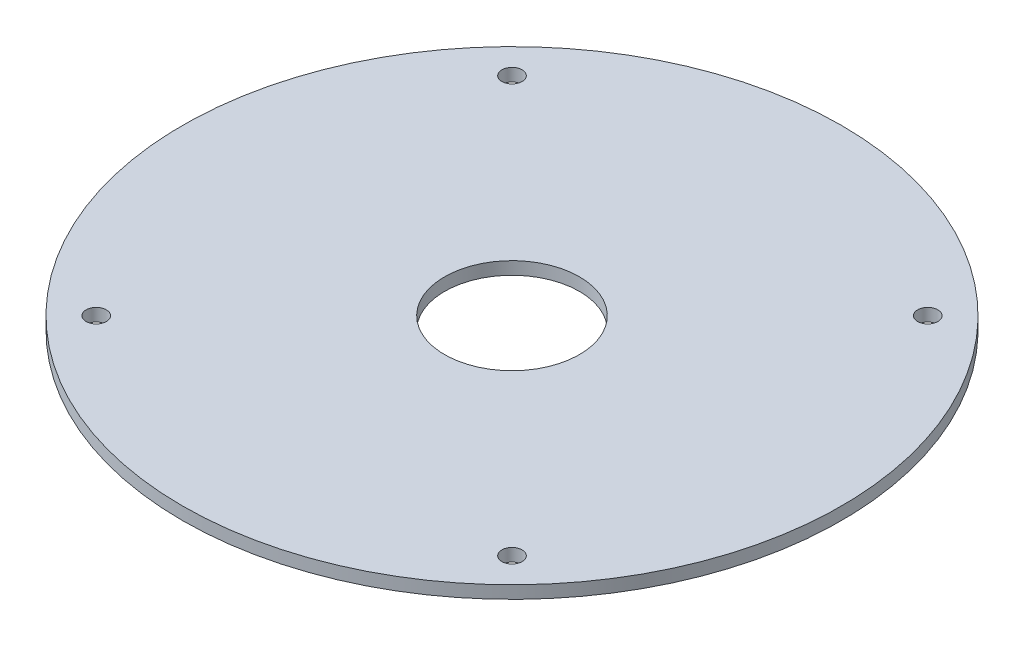
ISO-10303-21;
HEADER;
FILE_DESCRIPTION(('STEP AP214'),'2;1');
FILE_NAME('part.step','',(''),(''),'','','');
FILE_SCHEMA(('AUTOMOTIVE_DESIGN { 1 0 10303 214 1 1 1 1 }'));
ENDSEC;
DATA;
#1=APPLICATION_CONTEXT('core data for automotive mechanical design processes');
#2=APPLICATION_PROTOCOL_DEFINITION('international standard','automotive_design',2000,#1);
#3=PRODUCT_CONTEXT('',#1,'mechanical');
#4=PRODUCT('Part','Part','',(#3));
#5=PRODUCT_RELATED_PRODUCT_CATEGORY('part','',(#4));
#6=PRODUCT_DEFINITION_FORMATION('','',#4);
#7=PRODUCT_DEFINITION_CONTEXT('part definition',#1,'design');
#8=PRODUCT_DEFINITION('design','',#6,#7);
#9=PRODUCT_DEFINITION_SHAPE('','',#8);
#10=(LENGTH_UNIT() NAMED_UNIT(*) SI_UNIT(.MILLI.,.METRE.));
#11=(NAMED_UNIT(*) PLANE_ANGLE_UNIT() SI_UNIT($,.RADIAN.));
#12=(NAMED_UNIT(*) SI_UNIT($,.STERADIAN.) SOLID_ANGLE_UNIT());
#13=UNCERTAINTY_MEASURE_WITH_UNIT(LENGTH_MEASURE(1.E-05),#10,'distance_accuracy_value','');
#14=(GEOMETRIC_REPRESENTATION_CONTEXT(3) GLOBAL_UNCERTAINTY_ASSIGNED_CONTEXT((#13)) GLOBAL_UNIT_ASSIGNED_CONTEXT((#10,
#11,#12)) REPRESENTATION_CONTEXT('',''));
#15=CARTESIAN_POINT('',(0.,0.,0.));
#16=DIRECTION('',(0.,0.,1.));
#17=DIRECTION('',(1.,0.,0.));
#18=AXIS2_PLACEMENT_3D('',#15,#16,#17);
#19=CARTESIAN_POINT('',(0.,2.5,0.));
#20=DIRECTION('',(0.,-1.,0.));
#21=DIRECTION('',(0.,0.,-1.));
#22=AXIS2_PLACEMENT_3D('',#19,#20,#21);
#23=CYLINDRICAL_SURFACE('',#22,65.);
#24=CARTESIAN_POINT('',(0.,2.5,0.));
#25=DIRECTION('',(0.,1.,0.));
#26=DIRECTION('',(0.,0.,1.));
#27=AXIS2_PLACEMENT_3D('',#24,#25,#26);
#28=CIRCLE('',#27,65.);
#29=CARTESIAN_POINT('',(0.,2.5,65.));
#30=VERTEX_POINT('',#29);
#31=EDGE_CURVE('E10',#30,#30,#28,.T.);
#32=ORIENTED_EDGE('',*,*,#31,.F.);
#33=EDGE_LOOP('',(#32));
#34=FACE_BOUND('',#33,.T.);
#35=CARTESIAN_POINT('',(0.,0.,0.));
#36=DIRECTION('',(0.,1.,0.));
#37=DIRECTION('',(0.,0.,1.));
#38=AXIS2_PLACEMENT_3D('',#35,#36,#37);
#39=CIRCLE('',#38,65.);
#40=CARTESIAN_POINT('',(0.,0.,65.));
#41=VERTEX_POINT('',#40);
#42=EDGE_CURVE('E37',#41,#41,#39,.T.);
#43=ORIENTED_EDGE('',*,*,#42,.T.);
#44=EDGE_LOOP('',(#43));
#45=FACE_BOUND('',#44,.T.);
#46=ADVANCED_FACE('F34',(#34,#45),#23,.T.);
#47=CARTESIAN_POINT('',(0.,2.5,0.));
#48=DIRECTION('',(0.,1.,0.));
#49=DIRECTION('',(0.,0.,1.));
#50=AXIS2_PLACEMENT_3D('',#47,#48,#49);
#51=PLANE('',#50);
#52=CARTESIAN_POINT('',(-41.,2.5,-41.));
#53=DIRECTION('',(0.,-1.,0.));
#54=DIRECTION('',(0.,0.,-1.));
#55=AXIS2_PLACEMENT_3D('',#52,#53,#54);
#56=CIRCLE('',#55,2.);
#57=CARTESIAN_POINT('',(-41.,2.5,-43.));
#58=VERTEX_POINT('',#57);
#59=EDGE_CURVE('E58',#58,#58,#56,.T.);
#60=ORIENTED_EDGE('',*,*,#59,.T.);
#61=EDGE_LOOP('',(#60));
#62=FACE_BOUND('',#61,.T.);
#63=CARTESIAN_POINT('',(41.,2.5,-41.));
#64=DIRECTION('',(0.,-1.,0.));
#65=DIRECTION('',(0.,0.,-1.));
#66=AXIS2_PLACEMENT_3D('',#63,#64,#65);
#67=CIRCLE('',#66,2.);
#68=CARTESIAN_POINT('',(41.,2.5,-43.));
#69=VERTEX_POINT('',#68);
#70=EDGE_CURVE('E64',#69,#69,#67,.T.);
#71=ORIENTED_EDGE('',*,*,#70,.T.);
#72=EDGE_LOOP('',(#71));
#73=FACE_BOUND('',#72,.T.);
#74=CARTESIAN_POINT('',(41.,2.5,41.));
#75=DIRECTION('',(0.,-1.,0.));
#76=DIRECTION('',(0.,0.,-1.));
#77=AXIS2_PLACEMENT_3D('',#74,#75,#76);
#78=CIRCLE('',#77,2.);
#79=CARTESIAN_POINT('',(41.,2.5,39.));
#80=VERTEX_POINT('',#79);
#81=EDGE_CURVE('E70',#80,#80,#78,.T.);
#82=ORIENTED_EDGE('',*,*,#81,.T.);
#83=EDGE_LOOP('',(#82));
#84=FACE_BOUND('',#83,.T.);
#85=CARTESIAN_POINT('',(-41.,2.5,41.));
#86=DIRECTION('',(0.,-1.,0.));
#87=DIRECTION('',(0.,0.,-1.));
#88=AXIS2_PLACEMENT_3D('',#85,#86,#87);
#89=CIRCLE('',#88,2.);
#90=CARTESIAN_POINT('',(-41.,2.5,39.));
#91=VERTEX_POINT('',#90);
#92=EDGE_CURVE('E49',#91,#91,#89,.T.);
#93=ORIENTED_EDGE('',*,*,#92,.T.);
#94=EDGE_LOOP('',(#93));
#95=FACE_BOUND('',#94,.T.);
#96=CARTESIAN_POINT('',(0.,2.5,0.));
#97=DIRECTION('',(0.,-1.,0.));
#98=DIRECTION('',(0.,0.,-1.));
#99=AXIS2_PLACEMENT_3D('',#96,#97,#98);
#100=CIRCLE('',#99,13.3);
#101=CARTESIAN_POINT('',(0.,2.5,-13.3));
#102=VERTEX_POINT('',#101);
#103=EDGE_CURVE('E44',#102,#102,#100,.T.);
#104=ORIENTED_EDGE('',*,*,#103,.T.);
#105=EDGE_LOOP('',(#104));
#106=FACE_BOUND('',#105,.T.);
#107=ORIENTED_EDGE('',*,*,#31,.T.);
#108=EDGE_LOOP('',(#107));
#109=FACE_BOUND('',#108,.T.);
#110=ADVANCED_FACE('F82',(#62,#73,#84,#95,#106,#109),#51,.T.);
#111=CARTESIAN_POINT('',(0.,0.,0.));
#112=DIRECTION('',(0.,1.,0.));
#113=DIRECTION('',(0.,0.,1.));
#114=AXIS2_PLACEMENT_3D('',#111,#112,#113);
#115=PLANE('',#114);
#116=CARTESIAN_POINT('',(-41.,0.,-41.));
#117=DIRECTION('',(0.,-1.,0.));
#118=DIRECTION('',(0.,0.,-1.));
#119=AXIS2_PLACEMENT_3D('',#116,#117,#118);
#120=CIRCLE('',#119,2.);
#121=CARTESIAN_POINT('',(-41.,0.,-43.));
#122=VERTEX_POINT('',#121);
#123=EDGE_CURVE('E61',#122,#122,#120,.T.);
#124=ORIENTED_EDGE('',*,*,#123,.F.);
#125=EDGE_LOOP('',(#124));
#126=FACE_BOUND('',#125,.T.);
#127=CARTESIAN_POINT('',(41.,0.,-41.));
#128=DIRECTION('',(0.,-1.,0.));
#129=DIRECTION('',(0.,0.,-1.));
#130=AXIS2_PLACEMENT_3D('',#127,#128,#129);
#131=CIRCLE('',#130,2.);
#132=CARTESIAN_POINT('',(41.,0.,-43.));
#133=VERTEX_POINT('',#132);
#134=EDGE_CURVE('E67',#133,#133,#131,.T.);
#135=ORIENTED_EDGE('',*,*,#134,.F.);
#136=EDGE_LOOP('',(#135));
#137=FACE_BOUND('',#136,.T.);
#138=CARTESIAN_POINT('',(41.,0.,41.));
#139=DIRECTION('',(0.,-1.,0.));
#140=DIRECTION('',(0.,0.,-1.));
#141=AXIS2_PLACEMENT_3D('',#138,#139,#140);
#142=CIRCLE('',#141,2.);
#143=CARTESIAN_POINT('',(41.,0.,39.));
#144=VERTEX_POINT('',#143);
#145=EDGE_CURVE('E55',#144,#144,#142,.T.);
#146=ORIENTED_EDGE('',*,*,#145,.F.);
#147=EDGE_LOOP('',(#146));
#148=FACE_BOUND('',#147,.T.);
#149=CARTESIAN_POINT('',(-41.,0.,41.));
#150=DIRECTION('',(0.,-1.,0.));
#151=DIRECTION('',(0.,0.,-1.));
#152=AXIS2_PLACEMENT_3D('',#149,#150,#151);
#153=CIRCLE('',#152,2.);
#154=CARTESIAN_POINT('',(-41.,0.,39.));
#155=VERTEX_POINT('',#154);
#156=EDGE_CURVE('E52',#155,#155,#153,.T.);
#157=ORIENTED_EDGE('',*,*,#156,.F.);
#158=EDGE_LOOP('',(#157));
#159=FACE_BOUND('',#158,.T.);
#160=CARTESIAN_POINT('',(0.,0.,0.));
#161=DIRECTION('',(0.,-1.,0.));
#162=DIRECTION('',(0.,0.,-1.));
#163=AXIS2_PLACEMENT_3D('',#160,#161,#162);
#164=CIRCLE('',#163,13.3);
#165=CARTESIAN_POINT('',(0.,0.,-13.3));
#166=VERTEX_POINT('',#165);
#167=EDGE_CURVE('E46',#166,#166,#164,.T.);
#168=ORIENTED_EDGE('',*,*,#167,.F.);
#169=EDGE_LOOP('',(#168));
#170=FACE_BOUND('',#169,.T.);
#171=ORIENTED_EDGE('',*,*,#42,.F.);
#172=EDGE_LOOP('',(#171));
#173=FACE_BOUND('',#172,.T.);
#174=ADVANCED_FACE('F78',(#126,#137,#148,#159,#170,#173),#115,.F.);
#175=CARTESIAN_POINT('',(0.,2.5,0.));
#176=DIRECTION('',(0.,-1.,0.));
#177=DIRECTION('',(0.,0.,-1.));
#178=AXIS2_PLACEMENT_3D('',#175,#176,#177);
#179=CYLINDRICAL_SURFACE('',#178,13.3);
#180=ORIENTED_EDGE('',*,*,#103,.F.);
#181=EDGE_LOOP('',(#180));
#182=FACE_BOUND('',#181,.T.);
#183=ORIENTED_EDGE('',*,*,#167,.T.);
#184=EDGE_LOOP('',(#183));
#185=FACE_BOUND('',#184,.T.);
#186=ADVANCED_FACE('F81',(#182,#185),#179,.F.);
#187=CARTESIAN_POINT('',(-41.,2.5,41.));
#188=DIRECTION('',(0.,-1.,0.));
#189=DIRECTION('',(0.,0.,-1.));
#190=AXIS2_PLACEMENT_3D('',#187,#188,#189);
#191=CYLINDRICAL_SURFACE('',#190,2.);
#192=ORIENTED_EDGE('',*,*,#92,.F.);
#193=EDGE_LOOP('',(#192));
#194=FACE_BOUND('',#193,.T.);
#195=ORIENTED_EDGE('',*,*,#156,.T.);
#196=EDGE_LOOP('',(#195));
#197=FACE_BOUND('',#196,.T.);
#198=ADVANCED_FACE('F103',(#194,#197),#191,.F.);
#199=CARTESIAN_POINT('',(41.,2.5,41.));
#200=DIRECTION('',(0.,-1.,0.));
#201=DIRECTION('',(0.,0.,-1.));
#202=AXIS2_PLACEMENT_3D('',#199,#200,#201);
#203=CYLINDRICAL_SURFACE('',#202,2.);
#204=ORIENTED_EDGE('',*,*,#81,.F.);
#205=EDGE_LOOP('',(#204));
#206=FACE_BOUND('',#205,.T.);
#207=ORIENTED_EDGE('',*,*,#145,.T.);
#208=EDGE_LOOP('',(#207));
#209=FACE_BOUND('',#208,.T.);
#210=ADVANCED_FACE('F76',(#206,#209),#203,.F.);
#211=CARTESIAN_POINT('',(41.,2.5,-41.));
#212=DIRECTION('',(0.,-1.,0.));
#213=DIRECTION('',(0.,0.,-1.));
#214=AXIS2_PLACEMENT_3D('',#211,#212,#213);
#215=CYLINDRICAL_SURFACE('',#214,2.);
#216=ORIENTED_EDGE('',*,*,#70,.F.);
#217=EDGE_LOOP('',(#216));
#218=FACE_BOUND('',#217,.T.);
#219=ORIENTED_EDGE('',*,*,#134,.T.);
#220=EDGE_LOOP('',(#219));
#221=FACE_BOUND('',#220,.T.);
#222=ADVANCED_FACE('F111',(#218,#221),#215,.F.);
#223=CARTESIAN_POINT('',(-41.,2.5,-41.));
#224=DIRECTION('',(0.,-1.,0.));
#225=DIRECTION('',(0.,0.,-1.));
#226=AXIS2_PLACEMENT_3D('',#223,#224,#225);
#227=CYLINDRICAL_SURFACE('',#226,2.);
#228=ORIENTED_EDGE('',*,*,#59,.F.);
#229=EDGE_LOOP('',(#228));
#230=FACE_BOUND('',#229,.T.);
#231=ORIENTED_EDGE('',*,*,#123,.T.);
#232=EDGE_LOOP('',(#231));
#233=FACE_BOUND('',#232,.T.);
#234=ADVANCED_FACE('F108',(#230,#233),#227,.F.);
#235=CLOSED_SHELL('',(#46,#110,#174,#186,#198,#210,#222,#234));
#236=MANIFOLD_SOLID_BREP('B2',#235);
#237=ADVANCED_BREP_SHAPE_REPRESENTATION('',(#18,#236),#14);
#238=SHAPE_DEFINITION_REPRESENTATION(#9,#237);
ENDSEC;
END-ISO-10303-21;
